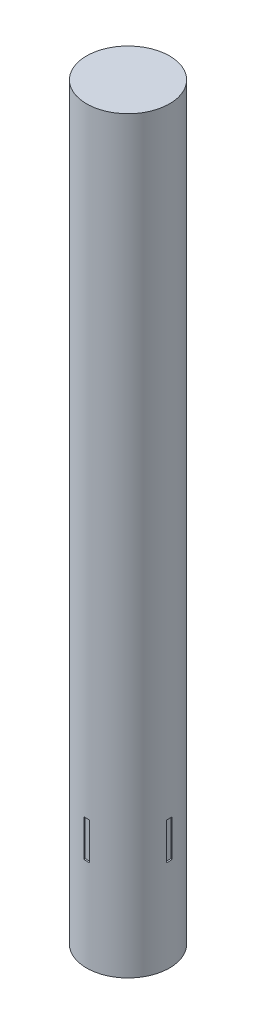
ISO-10303-21;
HEADER;
FILE_DESCRIPTION(('STEP AP214'),'2;1');
FILE_NAME('part.step','',(''),(''),'','','');
FILE_SCHEMA(('AUTOMOTIVE_DESIGN { 1 0 10303 214 1 1 1 1 }'));
ENDSEC;
DATA;
#1=APPLICATION_CONTEXT('core data for automotive mechanical design processes');
#2=APPLICATION_PROTOCOL_DEFINITION('international standard','automotive_design',2000,#1);
#3=PRODUCT_CONTEXT('',#1,'mechanical');
#4=PRODUCT('Part','Part','',(#3));
#5=PRODUCT_RELATED_PRODUCT_CATEGORY('part','',(#4));
#6=PRODUCT_DEFINITION_FORMATION('','',#4);
#7=PRODUCT_DEFINITION_CONTEXT('part definition',#1,'design');
#8=PRODUCT_DEFINITION('design','',#6,#7);
#9=PRODUCT_DEFINITION_SHAPE('','',#8);
#10=(LENGTH_UNIT() NAMED_UNIT(*) SI_UNIT(.MILLI.,.METRE.));
#11=(NAMED_UNIT(*) PLANE_ANGLE_UNIT() SI_UNIT($,.RADIAN.));
#12=(NAMED_UNIT(*) SI_UNIT($,.STERADIAN.) SOLID_ANGLE_UNIT());
#13=UNCERTAINTY_MEASURE_WITH_UNIT(LENGTH_MEASURE(1.E-05),#10,'distance_accuracy_value','');
#14=(GEOMETRIC_REPRESENTATION_CONTEXT(3) GLOBAL_UNCERTAINTY_ASSIGNED_CONTEXT((#13)) GLOBAL_UNIT_ASSIGNED_CONTEXT((#10,
#11,#12)) REPRESENTATION_CONTEXT('',''));
#15=CARTESIAN_POINT('',(0.,0.,0.));
#16=DIRECTION('',(0.,0.,1.));
#17=DIRECTION('',(1.,0.,0.));
#18=AXIS2_PLACEMENT_3D('',#15,#16,#17);
#19=CARTESIAN_POINT('',(132.,-1770.,7.50000000000032));
#20=DIRECTION('',(0.,0.,1.));
#21=DIRECTION('',(1.,0.,0.));
#22=AXIS2_PLACEMENT_3D('',#19,#20,#21);
#23=PLANE('',#22);
#24=DIRECTION('',(0.,-1.,0.));
#25=VECTOR('',#24,1.);
#26=CARTESIAN_POINT('',(108.,-1670.,7.50000000000024));
#27=LINE('',#26,#25);
#28=CARTESIAN_POINT('',(108.,-1670.,7.50000000000024));
#29=VERTEX_POINT('',#28);
#30=CARTESIAN_POINT('',(108.,-1770.,7.50000000000024));
#31=VERTEX_POINT('',#30);
#32=EDGE_CURVE('E196',#29,#31,#27,.T.);
#33=ORIENTED_EDGE('',*,*,#32,.F.);
#34=DIRECTION('',(-1.,0.,0.));
#35=VECTOR('',#34,1.);
#36=CARTESIAN_POINT('',(132.,-1670.,7.50000000000032));
#37=LINE('',#36,#35);
#38=CARTESIAN_POINT('',(111.748601780962,-1670.,7.50000000000025));
#39=VERTEX_POINT('',#38);
#40=EDGE_CURVE('E207',#39,#29,#37,.T.);
#41=ORIENTED_EDGE('',*,*,#40,.F.);
#42=DIRECTION('',(0.,-1.,0.));
#43=VECTOR('',#42,1.);
#44=CARTESIAN_POINT('',(111.748601780962,-2406.25322997416,7.50000000000025));
#45=LINE('',#44,#43);
#46=CARTESIAN_POINT('',(111.748601780962,-1770.,7.50000000000025));
#47=VERTEX_POINT('',#46);
#48=EDGE_CURVE('E11',#39,#47,#45,.T.);
#49=ORIENTED_EDGE('',*,*,#48,.T.);
#50=DIRECTION('',(-1.,0.,0.));
#51=VECTOR('',#50,1.);
#52=CARTESIAN_POINT('',(132.,-1770.,7.50000000000032));
#53=LINE('',#52,#51);
#54=EDGE_CURVE('E220',#47,#31,#53,.T.);
#55=ORIENTED_EDGE('',*,*,#54,.T.);
#56=EDGE_LOOP('',(#33,#41,#49,#55));
#57=FACE_BOUND('',#56,.T.);
#58=ADVANCED_FACE('F41',(#57),#23,.F.);
#59=CARTESIAN_POINT('',(132.,-1770.,-7.49999999999967));
#60=DIRECTION('',(0.,-1.,0.));
#61=DIRECTION('',(0.,0.,-1.));
#62=AXIS2_PLACEMENT_3D('',#59,#60,#61);
#63=PLANE('',#62);
#64=DIRECTION('',(1.,0.,0.));
#65=VECTOR('',#64,1.);
#66=CARTESIAN_POINT('',(-7.49999999999986,-1770.,108.));
#67=LINE('',#66,#65);
#68=CARTESIAN_POINT('',(-7.49999999999986,-1770.,108.));
#69=VERTEX_POINT('',#68);
#70=CARTESIAN_POINT('',(7.50000000000014,-1770.,108.));
#71=VERTEX_POINT('',#70);
#72=EDGE_CURVE('E188',#69,#71,#67,.T.);
#73=ORIENTED_EDGE('',*,*,#72,.F.);
#74=DIRECTION('',(0.,0.,-1.));
#75=VECTOR('',#74,1.);
#76=CARTESIAN_POINT('',(-7.49999999999986,-1770.,132.));
#77=LINE('',#76,#75);
#78=CARTESIAN_POINT('',(-7.49999999999986,-1770.,111.748601780962));
#79=VERTEX_POINT('',#78);
#80=EDGE_CURVE('E206',#79,#69,#77,.T.);
#81=ORIENTED_EDGE('',*,*,#80,.F.);
#82=CARTESIAN_POINT('',(0.,-1770.,0.));
#83=DIRECTION('',(0.,-1.,0.));
#84=DIRECTION('',(0.,0.,-1.));
#85=AXIS2_PLACEMENT_3D('',#82,#83,#84);
#86=CIRCLE('',#85,112.);
#87=CARTESIAN_POINT('',(7.50000000000014,-1770.,111.748601780962));
#88=VERTEX_POINT('',#87);
#89=EDGE_CURVE('E277',#79,#88,#86,.F.);
#90=ORIENTED_EDGE('',*,*,#89,.T.);
#91=DIRECTION('',(0.,0.,-1.));
#92=VECTOR('',#91,1.);
#93=CARTESIAN_POINT('',(7.50000000000014,-1770.,132.));
#94=LINE('',#93,#92);
#95=EDGE_CURVE('E209',#88,#71,#94,.T.);
#96=ORIENTED_EDGE('',*,*,#95,.T.);
#97=EDGE_LOOP('',(#73,#81,#90,#96));
#98=FACE_BOUND('',#97,.T.);
#99=ADVANCED_FACE('F296',(#98),#63,.F.);
#100=DIRECTION('',(0.,0.,1.));
#101=VECTOR('',#100,1.);
#102=CARTESIAN_POINT('',(-108.,-1770.,-7.50000000000099));
#103=LINE('',#102,#101);
#104=CARTESIAN_POINT('',(-108.,-1770.,-7.50000000000051));
#105=VERTEX_POINT('',#104);
#106=CARTESIAN_POINT('',(-108.,-1770.,7.49999999999901));
#107=VERTEX_POINT('',#106);
#108=EDGE_CURVE('E63',#105,#107,#103,.T.);
#109=ORIENTED_EDGE('',*,*,#108,.F.);
#110=DIRECTION('',(-1.,0.,0.));
#111=VECTOR('',#110,1.);
#112=CARTESIAN_POINT('',(132.,-1770.,-7.49999999999967));
#113=LINE('',#112,#111);
#114=CARTESIAN_POINT('',(-111.748601780962,-1770.,-7.50000000000053));
#115=VERTEX_POINT('',#114);
#116=EDGE_CURVE('E225',#105,#115,#113,.T.);
#117=ORIENTED_EDGE('',*,*,#116,.T.);
#118=CARTESIAN_POINT('',(-111.748601780962,-1770.,7.49999999999897));
#119=VERTEX_POINT('',#118);
#120=EDGE_CURVE('E275',#115,#119,#86,.F.);
#121=ORIENTED_EDGE('',*,*,#120,.T.);
#122=DIRECTION('',(1.,0.,0.));
#123=VECTOR('',#122,1.);
#124=CARTESIAN_POINT('',(-132.,-1770.,7.49999999999875));
#125=LINE('',#124,#123);
#126=EDGE_CURVE('E164',#119,#107,#125,.T.);
#127=ORIENTED_EDGE('',*,*,#126,.T.);
#128=EDGE_LOOP('',(#109,#117,#121,#127));
#129=FACE_BOUND('',#128,.T.);
#130=ADVANCED_FACE('F326',(#129),#63,.F.);
#131=DIRECTION('',(0.,0.,-1.));
#132=VECTOR('',#131,1.);
#133=CARTESIAN_POINT('',(108.,-1770.,7.50000000000024));
#134=LINE('',#133,#132);
#135=CARTESIAN_POINT('',(108.,-1770.,-7.49999999999976));
#136=VERTEX_POINT('',#135);
#137=EDGE_CURVE('E57',#31,#136,#134,.T.);
#138=ORIENTED_EDGE('',*,*,#137,.F.);
#139=ORIENTED_EDGE('',*,*,#54,.F.);
#140=CARTESIAN_POINT('',(111.748601780962,-1770.,-7.49999999999975));
#141=VERTEX_POINT('',#140);
#142=EDGE_CURVE('E47',#47,#141,#86,.F.);
#143=ORIENTED_EDGE('',*,*,#142,.T.);
#144=EDGE_CURVE('E219',#141,#136,#113,.T.);
#145=ORIENTED_EDGE('',*,*,#144,.T.);
#146=EDGE_LOOP('',(#138,#139,#143,#145));
#147=FACE_BOUND('',#146,.T.);
#148=ADVANCED_FACE('F330',(#147),#63,.F.);
#149=CARTESIAN_POINT('',(132.,-1770.,-7.49999999999967));
#150=DIRECTION('',(0.,0.,-1.));
#151=DIRECTION('',(-1.,0.,0.));
#152=AXIS2_PLACEMENT_3D('',#149,#150,#151);
#153=PLANE('',#152);
#154=DIRECTION('',(0.,-1.,0.));
#155=VECTOR('',#154,1.);
#156=CARTESIAN_POINT('',(-108.,-1670.,-7.50000000000099));
#157=LINE('',#156,#155);
#158=CARTESIAN_POINT('',(-108.,-1670.,-7.50000000000051));
#159=VERTEX_POINT('',#158);
#160=EDGE_CURVE('E174',#159,#105,#157,.T.);
#161=ORIENTED_EDGE('',*,*,#160,.F.);
#162=DIRECTION('',(-1.,0.,0.));
#163=VECTOR('',#162,1.);
#164=CARTESIAN_POINT('',(132.,-1670.,-7.49999999999967));
#165=LINE('',#164,#163);
#166=CARTESIAN_POINT('',(-111.748601780962,-1670.,-7.50000000000053));
#167=VERTEX_POINT('',#166);
#168=EDGE_CURVE('E175',#159,#167,#165,.T.);
#169=ORIENTED_EDGE('',*,*,#168,.T.);
#170=DIRECTION('',(0.,-1.,0.));
#171=VECTOR('',#170,1.);
#172=CARTESIAN_POINT('',(-111.748601780962,-2406.25322997416,-7.50000000000053));
#173=LINE('',#172,#171);
#174=EDGE_CURVE('E270',#167,#115,#173,.T.);
#175=ORIENTED_EDGE('',*,*,#174,.T.);
#176=ORIENTED_EDGE('',*,*,#116,.F.);
#177=EDGE_LOOP('',(#161,#169,#175,#176));
#178=FACE_BOUND('',#177,.T.);
#179=ADVANCED_FACE('F426',(#178),#153,.F.);
#180=DIRECTION('',(0.,1.,0.));
#181=VECTOR('',#180,1.);
#182=CARTESIAN_POINT('',(108.,-1770.,-7.49999999999976));
#183=LINE('',#182,#181);
#184=CARTESIAN_POINT('',(108.,-1670.,-7.49999999999976));
#185=VERTEX_POINT('',#184);
#186=EDGE_CURVE('E167',#136,#185,#183,.T.);
#187=ORIENTED_EDGE('',*,*,#186,.F.);
#188=ORIENTED_EDGE('',*,*,#144,.F.);
#189=DIRECTION('',(0.,-1.,0.));
#190=VECTOR('',#189,1.);
#191=CARTESIAN_POINT('',(111.748601780962,-2406.25322997416,-7.49999999999975));
#192=LINE('',#191,#190);
#193=CARTESIAN_POINT('',(111.748601780962,-1670.,-7.49999999999975));
#194=VERTEX_POINT('',#193);
#195=EDGE_CURVE('E276',#141,#194,#192,.F.);
#196=ORIENTED_EDGE('',*,*,#195,.T.);
#197=EDGE_CURVE('E224',#194,#185,#165,.T.);
#198=ORIENTED_EDGE('',*,*,#197,.T.);
#199=EDGE_LOOP('',(#187,#188,#196,#198));
#200=FACE_BOUND('',#199,.T.);
#201=ADVANCED_FACE('F361',(#200),#153,.F.);
#202=CARTESIAN_POINT('',(132.,-1670.,-7.49999999999967));
#203=DIRECTION('',(0.,1.,0.));
#204=DIRECTION('',(0.,0.,1.));
#205=AXIS2_PLACEMENT_3D('',#202,#203,#204);
#206=PLANE('',#205);
#207=DIRECTION('',(0.,0.,-1.));
#208=VECTOR('',#207,1.);
#209=CARTESIAN_POINT('',(-108.,-1670.,7.49999999999901));
#210=LINE('',#209,#208);
#211=CARTESIAN_POINT('',(-108.,-1670.,7.49999999999901));
#212=VERTEX_POINT('',#211);
#213=EDGE_CURVE('E168',#212,#159,#210,.T.);
#214=ORIENTED_EDGE('',*,*,#213,.F.);
#215=DIRECTION('',(1.,0.,0.));
#216=VECTOR('',#215,1.);
#217=CARTESIAN_POINT('',(-132.,-1670.,7.49999999999875));
#218=LINE('',#217,#216);
#219=CARTESIAN_POINT('',(-111.748601780962,-1670.,7.49999999999897));
#220=VERTEX_POINT('',#219);
#221=EDGE_CURVE('E154',#220,#212,#218,.T.);
#222=ORIENTED_EDGE('',*,*,#221,.F.);
#223=CARTESIAN_POINT('',(0.,-1670.,0.));
#224=DIRECTION('',(0.,1.,0.));
#225=DIRECTION('',(0.,0.,1.));
#226=AXIS2_PLACEMENT_3D('',#223,#224,#225);
#227=CIRCLE('',#226,112.);
#228=EDGE_CURVE('E264',#220,#167,#227,.F.);
#229=ORIENTED_EDGE('',*,*,#228,.T.);
#230=ORIENTED_EDGE('',*,*,#168,.F.);
#231=EDGE_LOOP('',(#214,#222,#229,#230));
#232=FACE_BOUND('',#231,.T.);
#233=ADVANCED_FACE('F171',(#232),#206,.F.);
#234=DIRECTION('',(-1.,0.,0.));
#235=VECTOR('',#234,1.);
#236=CARTESIAN_POINT('',(7.50000000000014,-1670.,108.));
#237=LINE('',#236,#235);
#238=CARTESIAN_POINT('',(7.50000000000014,-1670.,108.));
#239=VERTEX_POINT('',#238);
#240=CARTESIAN_POINT('',(-7.49999999999986,-1670.,108.));
#241=VERTEX_POINT('',#240);
#242=EDGE_CURVE('E178',#239,#241,#237,.T.);
#243=ORIENTED_EDGE('',*,*,#242,.F.);
#244=DIRECTION('',(0.,0.,-1.));
#245=VECTOR('',#244,1.);
#246=CARTESIAN_POINT('',(7.50000000000014,-1670.,132.));
#247=LINE('',#246,#245);
#248=CARTESIAN_POINT('',(7.50000000000014,-1670.,111.748601780962));
#249=VERTEX_POINT('',#248);
#250=EDGE_CURVE('E213',#249,#239,#247,.T.);
#251=ORIENTED_EDGE('',*,*,#250,.F.);
#252=CARTESIAN_POINT('',(-7.49999999999986,-1670.,111.748601780962));
#253=VERTEX_POINT('',#252);
#254=EDGE_CURVE('E267',#249,#253,#227,.F.);
#255=ORIENTED_EDGE('',*,*,#254,.T.);
#256=DIRECTION('',(0.,0.,-1.));
#257=VECTOR('',#256,1.);
#258=CARTESIAN_POINT('',(-7.49999999999986,-1670.,132.));
#259=LINE('',#258,#257);
#260=EDGE_CURVE('E204',#253,#241,#259,.T.);
#261=ORIENTED_EDGE('',*,*,#260,.T.);
#262=EDGE_LOOP('',(#243,#251,#255,#261));
#263=FACE_BOUND('',#262,.T.);
#264=ADVANCED_FACE('F303',(#263),#206,.F.);
#265=DIRECTION('',(0.,0.,1.));
#266=VECTOR('',#265,1.);
#267=CARTESIAN_POINT('',(108.,-1670.,-7.49999999999976));
#268=LINE('',#267,#266);
#269=EDGE_CURVE('E195',#185,#29,#268,.T.);
#270=ORIENTED_EDGE('',*,*,#269,.F.);
#271=ORIENTED_EDGE('',*,*,#197,.F.);
#272=EDGE_CURVE('E268',#194,#39,#227,.F.);
#273=ORIENTED_EDGE('',*,*,#272,.T.);
#274=ORIENTED_EDGE('',*,*,#40,.T.);
#275=EDGE_LOOP('',(#270,#271,#273,#274));
#276=FACE_BOUND('',#275,.T.);
#277=ADVANCED_FACE('F309',(#276),#206,.F.);
#278=CARTESIAN_POINT('',(-7.49999999999986,-1770.,132.));
#279=DIRECTION('',(-1.,0.,0.));
#280=DIRECTION('',(0.,0.,1.));
#281=AXIS2_PLACEMENT_3D('',#278,#279,#280);
#282=PLANE('',#281);
#283=DIRECTION('',(0.,-1.,0.));
#284=VECTOR('',#283,1.);
#285=CARTESIAN_POINT('',(-7.49999999999986,-1670.,108.));
#286=LINE('',#285,#284);
#287=EDGE_CURVE('E185',#241,#69,#286,.T.);
#288=ORIENTED_EDGE('',*,*,#287,.F.);
#289=ORIENTED_EDGE('',*,*,#260,.F.);
#290=DIRECTION('',(0.,-1.,0.));
#291=VECTOR('',#290,1.);
#292=CARTESIAN_POINT('',(-7.49999999999986,-2406.25322997416,111.748601780962));
#293=LINE('',#292,#291);
#294=EDGE_CURVE('E279',#253,#79,#293,.T.);
#295=ORIENTED_EDGE('',*,*,#294,.T.);
#296=ORIENTED_EDGE('',*,*,#80,.T.);
#297=EDGE_LOOP('',(#288,#289,#295,#296));
#298=FACE_BOUND('',#297,.T.);
#299=ADVANCED_FACE('F306',(#298),#282,.F.);
#300=CARTESIAN_POINT('',(7.50000000000014,-1770.,132.));
#301=DIRECTION('',(1.,0.,0.));
#302=DIRECTION('',(0.,0.,-1.));
#303=AXIS2_PLACEMENT_3D('',#300,#301,#302);
#304=PLANE('',#303);
#305=DIRECTION('',(0.,1.,0.));
#306=VECTOR('',#305,1.);
#307=CARTESIAN_POINT('',(7.50000000000014,-1770.,108.));
#308=LINE('',#307,#306);
#309=EDGE_CURVE('E192',#71,#239,#308,.T.);
#310=ORIENTED_EDGE('',*,*,#309,.F.);
#311=ORIENTED_EDGE('',*,*,#95,.F.);
#312=DIRECTION('',(0.,-1.,0.));
#313=VECTOR('',#312,1.);
#314=CARTESIAN_POINT('',(7.50000000000014,-2406.25322997416,111.748601780962));
#315=LINE('',#314,#313);
#316=EDGE_CURVE('E274',#88,#249,#315,.F.);
#317=ORIENTED_EDGE('',*,*,#316,.T.);
#318=ORIENTED_EDGE('',*,*,#250,.T.);
#319=EDGE_LOOP('',(#310,#311,#317,#318));
#320=FACE_BOUND('',#319,.T.);
#321=ADVANCED_FACE('F302',(#320),#304,.F.);
#322=CARTESIAN_POINT('',(-132.,-1770.,7.49999999999875));
#323=DIRECTION('',(0.,0.,1.));
#324=DIRECTION('',(1.,0.,0.));
#325=AXIS2_PLACEMENT_3D('',#322,#323,#324);
#326=PLANE('',#325);
#327=DIRECTION('',(0.,1.,0.));
#328=VECTOR('',#327,1.);
#329=CARTESIAN_POINT('',(-108.,-1770.,7.49999999999901));
#330=LINE('',#329,#328);
#331=EDGE_CURVE('E157',#107,#212,#330,.T.);
#332=ORIENTED_EDGE('',*,*,#331,.F.);
#333=ORIENTED_EDGE('',*,*,#126,.F.);
#334=DIRECTION('',(0.,-1.,0.));
#335=VECTOR('',#334,1.);
#336=CARTESIAN_POINT('',(-111.748601780962,-2406.25322997416,7.49999999999897));
#337=LINE('',#336,#335);
#338=EDGE_CURVE('E161',#119,#220,#337,.F.);
#339=ORIENTED_EDGE('',*,*,#338,.T.);
#340=ORIENTED_EDGE('',*,*,#221,.T.);
#341=EDGE_LOOP('',(#332,#333,#339,#340));
#342=FACE_BOUND('',#341,.T.);
#343=ADVANCED_FACE('F160',(#342),#326,.F.);
#344=CARTESIAN_POINT('',(7.49999999999986,-1770.,-132.));
#345=DIRECTION('',(1.,0.,0.));
#346=DIRECTION('',(0.,0.,-1.));
#347=AXIS2_PLACEMENT_3D('',#344,#345,#346);
#348=PLANE('',#347);
#349=DIRECTION('',(0.,-1.,0.));
#350=VECTOR('',#349,1.);
#351=CARTESIAN_POINT('',(7.49999999999986,-1670.,-108.));
#352=LINE('',#351,#350);
#353=CARTESIAN_POINT('',(7.49999999999986,-1670.,-108.));
#354=VERTEX_POINT('',#353);
#355=CARTESIAN_POINT('',(7.49999999999986,-1770.,-108.));
#356=VERTEX_POINT('',#355);
#357=EDGE_CURVE('E228',#354,#356,#352,.T.);
#358=ORIENTED_EDGE('',*,*,#357,.F.);
#359=DIRECTION('',(0.,0.,1.));
#360=VECTOR('',#359,1.);
#361=CARTESIAN_POINT('',(7.49999999999986,-1670.,-132.));
#362=LINE('',#361,#360);
#363=CARTESIAN_POINT('',(7.49999999999986,-1670.,-111.748601780962));
#364=VERTEX_POINT('',#363);
#365=EDGE_CURVE('E236',#364,#354,#362,.T.);
#366=ORIENTED_EDGE('',*,*,#365,.F.);
#367=DIRECTION('',(0.,-1.,0.));
#368=VECTOR('',#367,1.);
#369=CARTESIAN_POINT('',(7.49999999999986,-2406.25322997416,-111.748601780962));
#370=LINE('',#369,#368);
#371=CARTESIAN_POINT('',(7.49999999999986,-1770.,-111.748601780962));
#372=VERTEX_POINT('',#371);
#373=EDGE_CURVE('E265',#364,#372,#370,.T.);
#374=ORIENTED_EDGE('',*,*,#373,.T.);
#375=DIRECTION('',(0.,0.,1.));
#376=VECTOR('',#375,1.);
#377=CARTESIAN_POINT('',(7.49999999999986,-1770.,-132.));
#378=LINE('',#377,#376);
#379=EDGE_CURVE('E239',#372,#356,#378,.T.);
#380=ORIENTED_EDGE('',*,*,#379,.T.);
#381=EDGE_LOOP('',(#358,#366,#374,#380));
#382=FACE_BOUND('',#381,.T.);
#383=ADVANCED_FACE('F338',(#382),#348,.F.);
#384=CARTESIAN_POINT('',(-7.50000000000014,-1770.,-132.));
#385=DIRECTION('',(0.,-1.,0.));
#386=DIRECTION('',(0.,0.,-1.));
#387=AXIS2_PLACEMENT_3D('',#384,#385,#386);
#388=PLANE('',#387);
#389=DIRECTION('',(-1.,0.,0.));
#390=VECTOR('',#389,1.);
#391=CARTESIAN_POINT('',(7.49999999999986,-1770.,-108.));
#392=LINE('',#391,#390);
#393=CARTESIAN_POINT('',(-7.50000000000014,-1770.,-108.));
#394=VERTEX_POINT('',#393);
#395=EDGE_CURVE('E232',#356,#394,#392,.T.);
#396=ORIENTED_EDGE('',*,*,#395,.F.);
#397=ORIENTED_EDGE('',*,*,#379,.F.);
#398=CARTESIAN_POINT('',(0.,-1770.,0.));
#399=DIRECTION('',(0.,-1.,0.));
#400=DIRECTION('',(0.,0.,-1.));
#401=AXIS2_PLACEMENT_3D('',#398,#399,#400);
#402=CIRCLE('',#401,112.);
#403=CARTESIAN_POINT('',(-7.50000000000014,-1770.,-111.748601780962));
#404=VERTEX_POINT('',#403);
#405=EDGE_CURVE('E257',#372,#404,#402,.F.);
#406=ORIENTED_EDGE('',*,*,#405,.T.);
#407=DIRECTION('',(0.,0.,1.));
#408=VECTOR('',#407,1.);
#409=CARTESIAN_POINT('',(-7.50000000000014,-1770.,-132.));
#410=LINE('',#409,#408);
#411=EDGE_CURVE('E242',#404,#394,#410,.T.);
#412=ORIENTED_EDGE('',*,*,#411,.T.);
#413=EDGE_LOOP('',(#396,#397,#406,#412));
#414=FACE_BOUND('',#413,.T.);
#415=ADVANCED_FACE('F333',(#414),#388,.F.);
#416=CARTESIAN_POINT('',(-7.50000000000014,-1770.,-132.));
#417=DIRECTION('',(-1.,0.,0.));
#418=DIRECTION('',(0.,0.,1.));
#419=AXIS2_PLACEMENT_3D('',#416,#417,#418);
#420=PLANE('',#419);
#421=DIRECTION('',(0.,1.,0.));
#422=VECTOR('',#421,1.);
#423=CARTESIAN_POINT('',(-7.50000000000014,-1770.,-108.));
#424=LINE('',#423,#422);
#425=CARTESIAN_POINT('',(-7.50000000000014,-1670.,-108.));
#426=VERTEX_POINT('',#425);
#427=EDGE_CURVE('E235',#394,#426,#424,.T.);
#428=ORIENTED_EDGE('',*,*,#427,.F.);
#429=ORIENTED_EDGE('',*,*,#411,.F.);
#430=DIRECTION('',(0.,-1.,0.));
#431=VECTOR('',#430,1.);
#432=CARTESIAN_POINT('',(-7.50000000000014,-2406.25322997416,-111.748601780962));
#433=LINE('',#432,#431);
#434=CARTESIAN_POINT('',(-7.50000000000014,-1670.,-111.748601780962));
#435=VERTEX_POINT('',#434);
#436=EDGE_CURVE('E260',#404,#435,#433,.F.);
#437=ORIENTED_EDGE('',*,*,#436,.T.);
#438=DIRECTION('',(0.,0.,1.));
#439=VECTOR('',#438,1.);
#440=CARTESIAN_POINT('',(-7.50000000000014,-1670.,-132.));
#441=LINE('',#440,#439);
#442=EDGE_CURVE('E246',#435,#426,#441,.T.);
#443=ORIENTED_EDGE('',*,*,#442,.T.);
#444=EDGE_LOOP('',(#428,#429,#437,#443));
#445=FACE_BOUND('',#444,.T.);
#446=ADVANCED_FACE('F337',(#445),#420,.F.);
#447=CARTESIAN_POINT('',(-7.50000000000014,-1670.,-132.));
#448=DIRECTION('',(0.,1.,0.));
#449=DIRECTION('',(0.,0.,1.));
#450=AXIS2_PLACEMENT_3D('',#447,#448,#449);
#451=PLANE('',#450);
#452=DIRECTION('',(1.,0.,0.));
#453=VECTOR('',#452,1.);
#454=CARTESIAN_POINT('',(-7.50000000000014,-1670.,-108.));
#455=LINE('',#454,#453);
#456=EDGE_CURVE('E218',#426,#354,#455,.T.);
#457=ORIENTED_EDGE('',*,*,#456,.F.);
#458=ORIENTED_EDGE('',*,*,#442,.F.);
#459=CARTESIAN_POINT('',(0.,-1670.,0.));
#460=DIRECTION('',(0.,1.,0.));
#461=DIRECTION('',(0.,0.,1.));
#462=AXIS2_PLACEMENT_3D('',#459,#460,#461);
#463=CIRCLE('',#462,112.);
#464=EDGE_CURVE('E254',#435,#364,#463,.F.);
#465=ORIENTED_EDGE('',*,*,#464,.T.);
#466=ORIENTED_EDGE('',*,*,#365,.T.);
#467=EDGE_LOOP('',(#457,#458,#465,#466));
#468=FACE_BOUND('',#467,.T.);
#469=ADVANCED_FACE('F344',(#468),#451,.F.);
#470=CARTESIAN_POINT('',(0.,-2020.,0.));
#471=DIRECTION('',(0.,-1.,0.));
#472=DIRECTION('',(0.,0.,-1.));
#473=AXIS2_PLACEMENT_3D('',#470,#471,#472);
#474=PLANE('',#473);
#475=CARTESIAN_POINT('',(0.,-2020.,0.));
#476=DIRECTION('',(0.,-1.,0.));
#477=DIRECTION('',(0.,0.,-1.));
#478=AXIS2_PLACEMENT_3D('',#475,#476,#477);
#479=CIRCLE('',#478,107.);
#480=CARTESIAN_POINT('',(0.,-2020.,-107.));
#481=VERTEX_POINT('',#480);
#482=EDGE_CURVE('E546',#481,#481,#479,.T.);
#483=ORIENTED_EDGE('',*,*,#482,.F.);
#484=EDGE_LOOP('',(#483));
#485=FACE_BOUND('',#484,.T.);
#486=CARTESIAN_POINT('',(0.,-2020.,0.));
#487=DIRECTION('',(0.,-1.,0.));
#488=DIRECTION('',(0.,0.,-1.));
#489=AXIS2_PLACEMENT_3D('',#486,#487,#488);
#490=CIRCLE('',#489,112.);
#491=CARTESIAN_POINT('',(0.,-2020.,-112.));
#492=VERTEX_POINT('',#491);
#493=EDGE_CURVE('E252',#492,#492,#490,.T.);
#494=ORIENTED_EDGE('',*,*,#493,.T.);
#495=EDGE_LOOP('',(#494));
#496=FACE_BOUND('',#495,.T.);
#497=ADVANCED_FACE('F43',(#485,#496),#474,.T.);
#498=CARTESIAN_POINT('',(0.,-2406.25322997416,0.));
#499=DIRECTION('',(0.,-1.,0.));
#500=DIRECTION('',(0.,0.,-1.));
#501=AXIS2_PLACEMENT_3D('',#498,#499,#500);
#502=CYLINDRICAL_SURFACE('',#501,112.);
#503=ORIENTED_EDGE('',*,*,#48,.F.);
#504=ORIENTED_EDGE('',*,*,#272,.F.);
#505=ORIENTED_EDGE('',*,*,#195,.F.);
#506=ORIENTED_EDGE('',*,*,#142,.F.);
#507=EDGE_LOOP('',(#503,#504,#505,#506));
#508=FACE_BOUND('',#507,.T.);
#509=ORIENTED_EDGE('',*,*,#294,.F.);
#510=ORIENTED_EDGE('',*,*,#254,.F.);
#511=ORIENTED_EDGE('',*,*,#316,.F.);
#512=ORIENTED_EDGE('',*,*,#89,.F.);
#513=EDGE_LOOP('',(#509,#510,#511,#512));
#514=FACE_BOUND('',#513,.T.);
#515=ORIENTED_EDGE('',*,*,#120,.F.);
#516=ORIENTED_EDGE('',*,*,#174,.F.);
#517=ORIENTED_EDGE('',*,*,#228,.F.);
#518=ORIENTED_EDGE('',*,*,#338,.F.);
#519=EDGE_LOOP('',(#515,#516,#517,#518));
#520=FACE_BOUND('',#519,.T.);
#521=ORIENTED_EDGE('',*,*,#373,.F.);
#522=ORIENTED_EDGE('',*,*,#464,.F.);
#523=ORIENTED_EDGE('',*,*,#436,.F.);
#524=ORIENTED_EDGE('',*,*,#405,.F.);
#525=EDGE_LOOP('',(#521,#522,#523,#524));
#526=FACE_BOUND('',#525,.T.);
#527=CARTESIAN_POINT('',(0.,4.44089209850063E-13,0.));
#528=DIRECTION('',(0.,-1.,0.));
#529=DIRECTION('',(0.,0.,-1.));
#530=AXIS2_PLACEMENT_3D('',#527,#528,#529);
#531=CIRCLE('',#530,112.);
#532=CARTESIAN_POINT('',(0.,4.44089209850063E-13,-112.));
#533=VERTEX_POINT('',#532);
#534=EDGE_CURVE('E245',#533,#533,#531,.T.);
#535=ORIENTED_EDGE('',*,*,#534,.T.);
#536=EDGE_LOOP('',(#535));
#537=FACE_BOUND('',#536,.T.);
#538=ORIENTED_EDGE('',*,*,#493,.F.);
#539=EDGE_LOOP('',(#538));
#540=FACE_BOUND('',#539,.T.);
#541=ADVANCED_FACE('F298',(#508,#514,#520,#526,#537,#540),#502,.T.);
#542=CARTESIAN_POINT('',(0.,1.17796726568206E-13,0.));
#543=DIRECTION('',(0.,1.,0.));
#544=DIRECTION('',(0.,0.,1.));
#545=AXIS2_PLACEMENT_3D('',#542,#543,#544);
#546=PLANE('',#545);
#547=ORIENTED_EDGE('',*,*,#534,.F.);
#548=EDGE_LOOP('',(#547));
#549=FACE_BOUND('',#548,.T.);
#550=ADVANCED_FACE('F334',(#549),#546,.T.);
#551=CARTESIAN_POINT('',(0.,0.,-108.));
#552=DIRECTION('',(0.,0.,-1.));
#553=DIRECTION('',(-1.,0.,0.));
#554=AXIS2_PLACEMENT_3D('',#551,#552,#553);
#555=PLANE('',#554);
#556=ORIENTED_EDGE('',*,*,#456,.T.);
#557=ORIENTED_EDGE('',*,*,#357,.T.);
#558=ORIENTED_EDGE('',*,*,#395,.T.);
#559=ORIENTED_EDGE('',*,*,#427,.T.);
#560=EDGE_LOOP('',(#556,#557,#558,#559));
#561=FACE_BOUND('',#560,.T.);
#562=ADVANCED_FACE('F332',(#561),#555,.T.);
#563=CARTESIAN_POINT('',(-108.,0.,-1.13123995378518E-12));
#564=DIRECTION('',(-1.,0.,0.));
#565=DIRECTION('',(0.,0.,1.));
#566=AXIS2_PLACEMENT_3D('',#563,#564,#565);
#567=PLANE('',#566);
#568=ORIENTED_EDGE('',*,*,#213,.T.);
#569=ORIENTED_EDGE('',*,*,#160,.T.);
#570=ORIENTED_EDGE('',*,*,#108,.T.);
#571=ORIENTED_EDGE('',*,*,#331,.T.);
#572=EDGE_LOOP('',(#568,#569,#570,#571));
#573=FACE_BOUND('',#572,.T.);
#574=ADVANCED_FACE('F179',(#573),#567,.T.);
#575=CARTESIAN_POINT('',(0.,0.,108.));
#576=DIRECTION('',(0.,0.,1.));
#577=DIRECTION('',(1.,0.,0.));
#578=AXIS2_PLACEMENT_3D('',#575,#576,#577);
#579=PLANE('',#578);
#580=ORIENTED_EDGE('',*,*,#242,.T.);
#581=ORIENTED_EDGE('',*,*,#287,.T.);
#582=ORIENTED_EDGE('',*,*,#72,.T.);
#583=ORIENTED_EDGE('',*,*,#309,.T.);
#584=EDGE_LOOP('',(#580,#581,#582,#583));
#585=FACE_BOUND('',#584,.T.);
#586=ADVANCED_FACE('F308',(#585),#579,.T.);
#587=CARTESIAN_POINT('',(108.,0.,3.77079984595058E-13));
#588=DIRECTION('',(1.,0.,0.));
#589=DIRECTION('',(0.,0.,-1.));
#590=AXIS2_PLACEMENT_3D('',#587,#588,#589);
#591=PLANE('',#590);
#592=ORIENTED_EDGE('',*,*,#269,.T.);
#593=ORIENTED_EDGE('',*,*,#32,.T.);
#594=ORIENTED_EDGE('',*,*,#137,.T.);
#595=ORIENTED_EDGE('',*,*,#186,.T.);
#596=EDGE_LOOP('',(#592,#593,#594,#595));
#597=FACE_BOUND('',#596,.T.);
#598=ADVANCED_FACE('F364',(#597),#591,.T.);
#599=CARTESIAN_POINT('',(0.,-1820.,0.));
#600=DIRECTION('',(0.,-1.,0.));
#601=DIRECTION('',(0.,0.,-1.));
#602=AXIS2_PLACEMENT_3D('',#599,#600,#601);
#603=CYLINDRICAL_SURFACE('',#602,107.);
#604=CARTESIAN_POINT('',(0.,-1820.,0.));
#605=DIRECTION('',(0.,-1.,0.));
#606=DIRECTION('',(0.,0.,-1.));
#607=AXIS2_PLACEMENT_3D('',#604,#605,#606);
#608=CIRCLE('',#607,107.);
#609=CARTESIAN_POINT('',(0.,-1820.,-107.));
#610=VERTEX_POINT('',#609);
#611=EDGE_CURVE('E176',#610,#610,#608,.T.);
#612=ORIENTED_EDGE('',*,*,#611,.F.);
#613=EDGE_LOOP('',(#612));
#614=FACE_BOUND('',#613,.T.);
#615=ORIENTED_EDGE('',*,*,#482,.T.);
#616=EDGE_LOOP('',(#615));
#617=FACE_BOUND('',#616,.T.);
#618=ADVANCED_FACE('F370',(#614,#617),#603,.F.);
#619=CARTESIAN_POINT('',(0.,-1820.,0.));
#620=DIRECTION('',(0.,-1.,0.));
#621=DIRECTION('',(0.,0.,-1.));
#622=AXIS2_PLACEMENT_3D('',#619,#620,#621);
#623=PLANE('',#622);
#624=ORIENTED_EDGE('',*,*,#611,.T.);
#625=EDGE_LOOP('',(#624));
#626=FACE_BOUND('',#625,.T.);
#627=ADVANCED_FACE('F373',(#626),#623,.T.);
#628=CLOSED_SHELL('',(#58,#99,#130,#148,#179,#201,#233,#264,#277,#299,#321,#343,#383,#415,#446,
#469,#497,#541,#550,#562,#574,#586,#598,#618,#627));
#629=MANIFOLD_SOLID_BREP('B2',#628);
#630=ADVANCED_BREP_SHAPE_REPRESENTATION('',(#18,#629),#14);
#631=SHAPE_DEFINITION_REPRESENTATION(#9,#630);
ENDSEC;
END-ISO-10303-21;
